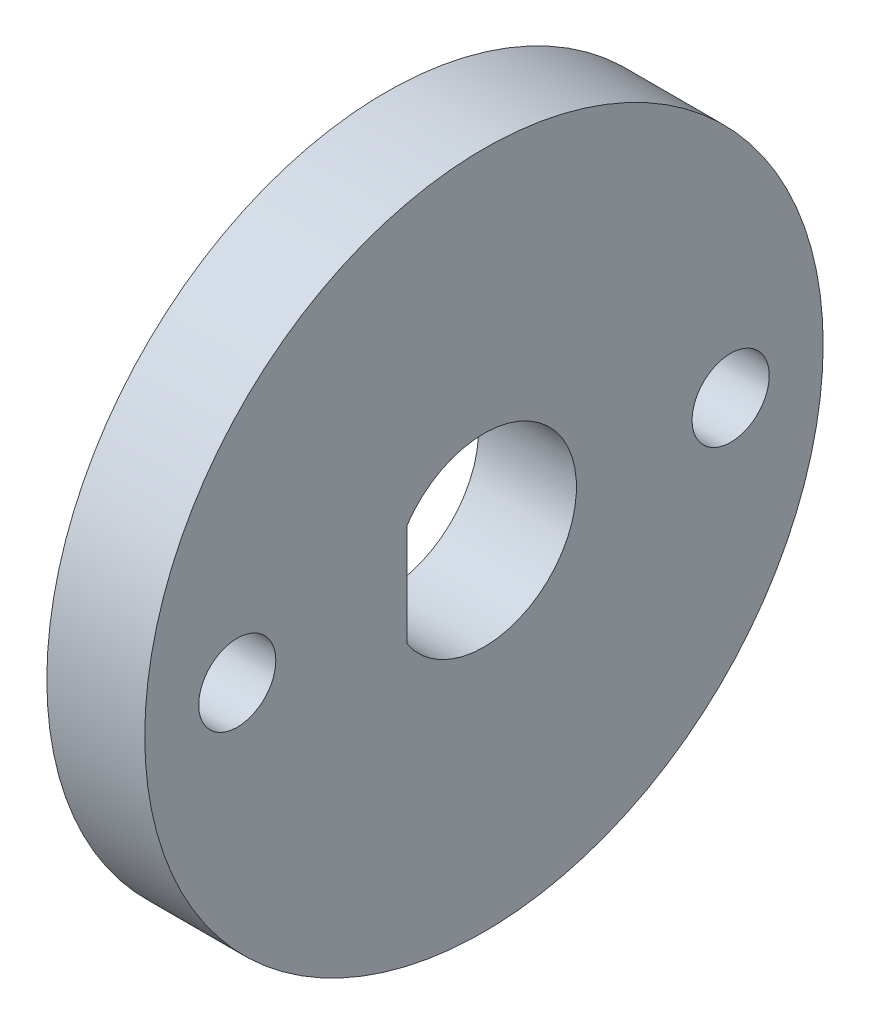
ISO-10303-21;
HEADER;
FILE_DESCRIPTION(('STEP AP214'),'2;1');
FILE_NAME('part.step','',(''),(''),'','','');
FILE_SCHEMA(('AUTOMOTIVE_DESIGN { 1 0 10303 214 1 1 1 1 }'));
ENDSEC;
DATA;
#1=APPLICATION_CONTEXT('core data for automotive mechanical design processes');
#2=APPLICATION_PROTOCOL_DEFINITION('international standard','automotive_design',2000,#1);
#3=PRODUCT_CONTEXT('',#1,'mechanical');
#4=PRODUCT('Part','Part','',(#3));
#5=PRODUCT_RELATED_PRODUCT_CATEGORY('part','',(#4));
#6=PRODUCT_DEFINITION_FORMATION('','',#4);
#7=PRODUCT_DEFINITION_CONTEXT('part definition',#1,'design');
#8=PRODUCT_DEFINITION('design','',#6,#7);
#9=PRODUCT_DEFINITION_SHAPE('','',#8);
#10=(LENGTH_UNIT() NAMED_UNIT(*) SI_UNIT(.MILLI.,.METRE.));
#11=(NAMED_UNIT(*) PLANE_ANGLE_UNIT() SI_UNIT($,.RADIAN.));
#12=(NAMED_UNIT(*) SI_UNIT($,.STERADIAN.) SOLID_ANGLE_UNIT());
#13=UNCERTAINTY_MEASURE_WITH_UNIT(LENGTH_MEASURE(1.E-05),#10,'distance_accuracy_value','');
#14=(GEOMETRIC_REPRESENTATION_CONTEXT(3) GLOBAL_UNCERTAINTY_ASSIGNED_CONTEXT((#13)) GLOBAL_UNIT_ASSIGNED_CONTEXT((#10,
#11,#12)) REPRESENTATION_CONTEXT('',''));
#15=CARTESIAN_POINT('',(0.,0.,0.));
#16=DIRECTION('',(0.,0.,1.));
#17=DIRECTION('',(1.,0.,0.));
#18=AXIS2_PLACEMENT_3D('',#15,#16,#17);
#19=CARTESIAN_POINT('',(3.175,0.,0.));
#20=DIRECTION('',(-1.,0.,0.));
#21=DIRECTION('',(0.,0.,1.));
#22=AXIS2_PLACEMENT_3D('',#19,#20,#21);
#23=CYLINDRICAL_SURFACE('',#22,3.);
#24=CARTESIAN_POINT('',(0.,0.,0.));
#25=DIRECTION('',(1.,0.,0.));
#26=DIRECTION('',(0.,0.,-1.));
#27=AXIS2_PLACEMENT_3D('',#24,#25,#26);
#28=CIRCLE('',#27,3.);
#29=CARTESIAN_POINT('',(0.,-1.6583123951777,2.5));
#30=VERTEX_POINT('',#29);
#31=CARTESIAN_POINT('',(0.,1.6583123951777,2.5));
#32=VERTEX_POINT('',#31);
#33=EDGE_CURVE('E56',#30,#32,#28,.T.);
#34=ORIENTED_EDGE('',*,*,#33,.F.);
#35=DIRECTION('',(-1.,0.,0.));
#36=VECTOR('',#35,1.);
#37=CARTESIAN_POINT('',(3.175,-1.6583123951777,2.5));
#38=LINE('',#37,#36);
#39=CARTESIAN_POINT('',(3.175,-1.6583123951777,2.5));
#40=VERTEX_POINT('',#39);
#41=EDGE_CURVE('E11',#40,#30,#38,.T.);
#42=ORIENTED_EDGE('',*,*,#41,.F.);
#43=CARTESIAN_POINT('',(3.175,0.,0.));
#44=DIRECTION('',(1.,0.,0.));
#45=DIRECTION('',(0.,0.,-1.));
#46=AXIS2_PLACEMENT_3D('',#43,#44,#45);
#47=CIRCLE('',#46,3.);
#48=CARTESIAN_POINT('',(3.175,1.6583123951777,2.5));
#49=VERTEX_POINT('',#48);
#50=EDGE_CURVE('E59',#40,#49,#47,.T.);
#51=ORIENTED_EDGE('',*,*,#50,.T.);
#52=DIRECTION('',(-1.,0.,0.));
#53=VECTOR('',#52,1.);
#54=CARTESIAN_POINT('',(3.175,1.6583123951777,2.5));
#55=LINE('',#54,#53);
#56=EDGE_CURVE('E41',#49,#32,#55,.T.);
#57=ORIENTED_EDGE('',*,*,#56,.T.);
#58=EDGE_LOOP('',(#34,#42,#51,#57));
#59=FACE_BOUND('',#58,.T.);
#60=ADVANCED_FACE('F33',(#59),#23,.F.);
#61=CARTESIAN_POINT('',(3.175,0.,8.));
#62=DIRECTION('',(-1.,0.,0.));
#63=DIRECTION('',(0.,0.,1.));
#64=AXIS2_PLACEMENT_3D('',#61,#62,#63);
#65=CYLINDRICAL_SURFACE('',#64,1.25);
#66=CARTESIAN_POINT('',(3.175,0.,8.));
#67=DIRECTION('',(1.,0.,0.));
#68=DIRECTION('',(0.,0.,-1.));
#69=AXIS2_PLACEMENT_3D('',#66,#67,#68);
#70=CIRCLE('',#69,1.25);
#71=CARTESIAN_POINT('',(3.175,0.,6.75));
#72=VERTEX_POINT('',#71);
#73=EDGE_CURVE('E88',#72,#72,#70,.T.);
#74=ORIENTED_EDGE('',*,*,#73,.T.);
#75=EDGE_LOOP('',(#74));
#76=FACE_BOUND('',#75,.T.);
#77=CARTESIAN_POINT('',(0.,0.,8.));
#78=DIRECTION('',(1.,0.,0.));
#79=DIRECTION('',(0.,0.,-1.));
#80=AXIS2_PLACEMENT_3D('',#77,#78,#79);
#81=CIRCLE('',#80,1.25);
#82=CARTESIAN_POINT('',(0.,0.,6.75));
#83=VERTEX_POINT('',#82);
#84=EDGE_CURVE('E71',#83,#83,#81,.T.);
#85=ORIENTED_EDGE('',*,*,#84,.F.);
#86=EDGE_LOOP('',(#85));
#87=FACE_BOUND('',#86,.T.);
#88=ADVANCED_FACE('F108',(#76,#87),#65,.F.);
#89=CARTESIAN_POINT('',(3.175,0.,-8.));
#90=DIRECTION('',(-1.,0.,0.));
#91=DIRECTION('',(0.,0.,1.));
#92=AXIS2_PLACEMENT_3D('',#89,#90,#91);
#93=CYLINDRICAL_SURFACE('',#92,1.25);
#94=CARTESIAN_POINT('',(3.175,0.,-8.));
#95=DIRECTION('',(1.,0.,0.));
#96=DIRECTION('',(0.,0.,-1.));
#97=AXIS2_PLACEMENT_3D('',#94,#95,#96);
#98=CIRCLE('',#97,1.25);
#99=CARTESIAN_POINT('',(3.175,0.,-9.25));
#100=VERTEX_POINT('',#99);
#101=EDGE_CURVE('E83',#100,#100,#98,.T.);
#102=ORIENTED_EDGE('',*,*,#101,.T.);
#103=EDGE_LOOP('',(#102));
#104=FACE_BOUND('',#103,.T.);
#105=CARTESIAN_POINT('',(0.,0.,-8.));
#106=DIRECTION('',(1.,0.,0.));
#107=DIRECTION('',(0.,0.,-1.));
#108=AXIS2_PLACEMENT_3D('',#105,#106,#107);
#109=CIRCLE('',#108,1.25);
#110=CARTESIAN_POINT('',(0.,0.,-9.25));
#111=VERTEX_POINT('',#110);
#112=EDGE_CURVE('E68',#111,#111,#109,.T.);
#113=ORIENTED_EDGE('',*,*,#112,.F.);
#114=EDGE_LOOP('',(#113));
#115=FACE_BOUND('',#114,.T.);
#116=ADVANCED_FACE('F104',(#104,#115),#93,.F.);
#117=CARTESIAN_POINT('',(3.175,0.,2.5));
#118=DIRECTION('',(0.,0.,-1.));
#119=DIRECTION('',(0.,1.,0.));
#120=AXIS2_PLACEMENT_3D('',#117,#118,#119);
#121=PLANE('',#120);
#122=DIRECTION('',(0.,-1.,0.));
#123=VECTOR('',#122,1.);
#124=CARTESIAN_POINT('',(0.,0.,2.5));
#125=LINE('',#124,#123);
#126=EDGE_CURVE('E65',#32,#30,#125,.T.);
#127=ORIENTED_EDGE('',*,*,#126,.F.);
#128=ORIENTED_EDGE('',*,*,#56,.F.);
#129=DIRECTION('',(0.,-1.,0.));
#130=VECTOR('',#129,1.);
#131=CARTESIAN_POINT('',(3.175,0.,2.5));
#132=LINE('',#131,#130);
#133=EDGE_CURVE('E81',#49,#40,#132,.T.);
#134=ORIENTED_EDGE('',*,*,#133,.T.);
#135=ORIENTED_EDGE('',*,*,#41,.T.);
#136=EDGE_LOOP('',(#127,#128,#134,#135));
#137=FACE_BOUND('',#136,.T.);
#138=ADVANCED_FACE('F67',(#137),#121,.T.);
#139=CARTESIAN_POINT('',(3.175,0.,0.));
#140=DIRECTION('',(-1.,0.,0.));
#141=DIRECTION('',(0.,0.,1.));
#142=AXIS2_PLACEMENT_3D('',#139,#140,#141);
#143=CYLINDRICAL_SURFACE('',#142,11.);
#144=CARTESIAN_POINT('',(3.175,0.,0.));
#145=DIRECTION('',(1.,0.,0.));
#146=DIRECTION('',(0.,0.,-1.));
#147=AXIS2_PLACEMENT_3D('',#144,#145,#146);
#148=CIRCLE('',#147,11.);
#149=CARTESIAN_POINT('',(3.175,0.,-11.));
#150=VERTEX_POINT('',#149);
#151=EDGE_CURVE('E61',#150,#150,#148,.T.);
#152=ORIENTED_EDGE('',*,*,#151,.F.);
#153=EDGE_LOOP('',(#152));
#154=FACE_BOUND('',#153,.T.);
#155=CARTESIAN_POINT('',(0.,0.,0.));
#156=DIRECTION('',(1.,0.,0.));
#157=DIRECTION('',(0.,0.,-1.));
#158=AXIS2_PLACEMENT_3D('',#155,#156,#157);
#159=CIRCLE('',#158,11.);
#160=CARTESIAN_POINT('',(0.,0.,-11.));
#161=VERTEX_POINT('',#160);
#162=EDGE_CURVE('E77',#161,#161,#159,.T.);
#163=ORIENTED_EDGE('',*,*,#162,.T.);
#164=EDGE_LOOP('',(#163));
#165=FACE_BOUND('',#164,.T.);
#166=ADVANCED_FACE('F95',(#154,#165),#143,.T.);
#167=CARTESIAN_POINT('',(3.175,0.,0.));
#168=DIRECTION('',(1.,0.,0.));
#169=DIRECTION('',(0.,0.,-1.));
#170=AXIS2_PLACEMENT_3D('',#167,#168,#169);
#171=PLANE('',#170);
#172=ORIENTED_EDGE('',*,*,#50,.F.);
#173=ORIENTED_EDGE('',*,*,#133,.F.);
#174=EDGE_LOOP('',(#172,#173));
#175=FACE_BOUND('',#174,.T.);
#176=ORIENTED_EDGE('',*,*,#101,.F.);
#177=EDGE_LOOP('',(#176));
#178=FACE_BOUND('',#177,.T.);
#179=ORIENTED_EDGE('',*,*,#73,.F.);
#180=EDGE_LOOP('',(#179));
#181=FACE_BOUND('',#180,.T.);
#182=ORIENTED_EDGE('',*,*,#151,.T.);
#183=EDGE_LOOP('',(#182));
#184=FACE_BOUND('',#183,.T.);
#185=ADVANCED_FACE('F93',(#175,#178,#181,#184),#171,.T.);
#186=CARTESIAN_POINT('',(0.,0.,0.));
#187=DIRECTION('',(1.,0.,0.));
#188=DIRECTION('',(0.,0.,-1.));
#189=AXIS2_PLACEMENT_3D('',#186,#187,#188);
#190=PLANE('',#189);
#191=ORIENTED_EDGE('',*,*,#33,.T.);
#192=ORIENTED_EDGE('',*,*,#126,.T.);
#193=EDGE_LOOP('',(#191,#192));
#194=FACE_BOUND('',#193,.T.);
#195=ORIENTED_EDGE('',*,*,#112,.T.);
#196=EDGE_LOOP('',(#195));
#197=FACE_BOUND('',#196,.T.);
#198=ORIENTED_EDGE('',*,*,#84,.T.);
#199=EDGE_LOOP('',(#198));
#200=FACE_BOUND('',#199,.T.);
#201=ORIENTED_EDGE('',*,*,#162,.F.);
#202=EDGE_LOOP('',(#201));
#203=FACE_BOUND('',#202,.T.);
#204=ADVANCED_FACE('F63',(#194,#197,#200,#203),#190,.F.);
#205=CLOSED_SHELL('',(#60,#88,#116,#138,#166,#185,#204));
#206=MANIFOLD_SOLID_BREP('B2',#205);
#207=ADVANCED_BREP_SHAPE_REPRESENTATION('',(#18,#206),#14);
#208=SHAPE_DEFINITION_REPRESENTATION(#9,#207);
ENDSEC;
END-ISO-10303-21;
